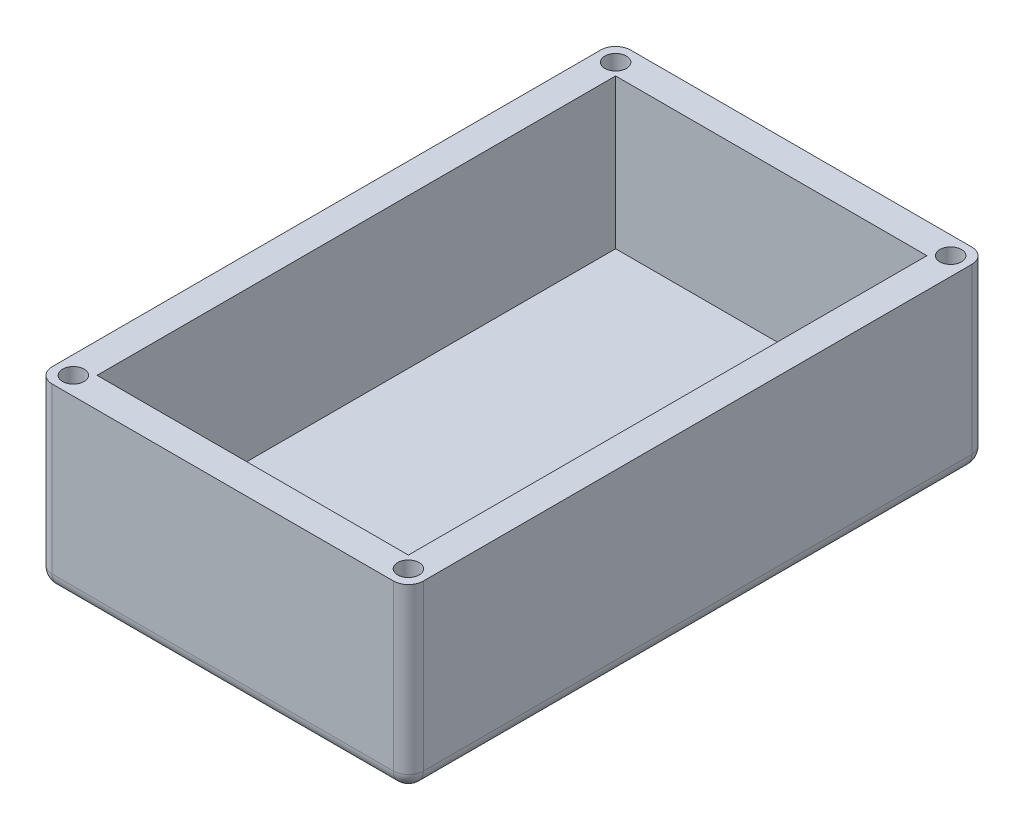
ISO-10303-21;
HEADER;
FILE_DESCRIPTION(('STEP AP214'),'2;1');
FILE_NAME('part.step','',(''),(''),'','','');
FILE_SCHEMA(('AUTOMOTIVE_DESIGN { 1 0 10303 214 1 1 1 1 }'));
ENDSEC;
DATA;
#1=APPLICATION_CONTEXT('core data for automotive mechanical design processes');
#2=APPLICATION_PROTOCOL_DEFINITION('international standard','automotive_design',2000,#1);
#3=PRODUCT_CONTEXT('',#1,'mechanical');
#4=PRODUCT('Part','Part','',(#3));
#5=PRODUCT_RELATED_PRODUCT_CATEGORY('part','',(#4));
#6=PRODUCT_DEFINITION_FORMATION('','',#4);
#7=PRODUCT_DEFINITION_CONTEXT('part definition',#1,'design');
#8=PRODUCT_DEFINITION('design','',#6,#7);
#9=PRODUCT_DEFINITION_SHAPE('','',#8);
#10=(LENGTH_UNIT() NAMED_UNIT(*) SI_UNIT(.MILLI.,.METRE.));
#11=(NAMED_UNIT(*) PLANE_ANGLE_UNIT() SI_UNIT($,.RADIAN.));
#12=(NAMED_UNIT(*) SI_UNIT($,.STERADIAN.) SOLID_ANGLE_UNIT());
#13=UNCERTAINTY_MEASURE_WITH_UNIT(LENGTH_MEASURE(1.E-05),#10,'distance_accuracy_value','');
#14=(GEOMETRIC_REPRESENTATION_CONTEXT(3) GLOBAL_UNCERTAINTY_ASSIGNED_CONTEXT((#13)) GLOBAL_UNIT_ASSIGNED_CONTEXT((#10,
#11,#12)) REPRESENTATION_CONTEXT('',''));
#15=CARTESIAN_POINT('',(0.,0.,0.));
#16=DIRECTION('',(0.,0.,1.));
#17=DIRECTION('',(1.,0.,0.));
#18=AXIS2_PLACEMENT_3D('',#15,#16,#17);
#19=CARTESIAN_POINT('',(0.,19.05,0.));
#20=DIRECTION('',(0.,-1.,0.));
#21=DIRECTION('',(0.,0.,-1.));
#22=AXIS2_PLACEMENT_3D('',#19,#20,#21);
#23=PLANE('',#22);
#24=CARTESIAN_POINT('',(-17.7672358569497,19.05,28.7572358569497));
#25=DIRECTION('',(0.,1.,0.));
#26=DIRECTION('',(0.,0.,1.));
#27=AXIS2_PLACEMENT_3D('',#24,#25,#26);
#28=CIRCLE('',#27,1.143);
#29=CARTESIAN_POINT('',(-17.7672358569497,19.05,29.9002358569497));
#30=VERTEX_POINT('',#29);
#31=EDGE_CURVE('E409',#30,#30,#28,.F.);
#32=ORIENTED_EDGE('',*,*,#31,.T.);
#33=EDGE_LOOP('',(#32));
#34=FACE_BOUND('',#33,.T.);
#35=DIRECTION('',(-1.,0.,0.));
#36=VECTOR('',#35,1.);
#37=CARTESIAN_POINT('',(19.685,19.05,30.675));
#38=LINE('',#37,#36);
#39=CARTESIAN_POINT('',(18.0975,19.05,30.675));
#40=VERTEX_POINT('',#39);
#41=CARTESIAN_POINT('',(-18.0975,19.05,30.675));
#42=VERTEX_POINT('',#41);
#43=EDGE_CURVE('E181',#40,#42,#38,.T.);
#44=ORIENTED_EDGE('',*,*,#43,.F.);
#45=CARTESIAN_POINT('',(18.0975,19.05,29.0875));
#46=DIRECTION('',(0.,-1.,0.));
#47=DIRECTION('',(0.,0.,-1.));
#48=AXIS2_PLACEMENT_3D('',#45,#46,#47);
#49=CIRCLE('',#48,1.5875);
#50=CARTESIAN_POINT('',(19.685,19.05,29.0875));
#51=VERTEX_POINT('',#50);
#52=EDGE_CURVE('E11',#40,#51,#49,.F.);
#53=ORIENTED_EDGE('',*,*,#52,.T.);
#54=DIRECTION('',(0.,0.,1.));
#55=VECTOR('',#54,1.);
#56=CARTESIAN_POINT('',(19.685,19.05,-30.675));
#57=LINE('',#56,#55);
#58=CARTESIAN_POINT('',(19.685,19.05,-29.0875));
#59=VERTEX_POINT('',#58);
#60=EDGE_CURVE('E175',#59,#51,#57,.T.);
#61=ORIENTED_EDGE('',*,*,#60,.F.);
#62=CARTESIAN_POINT('',(18.0975,19.05,-29.0875));
#63=DIRECTION('',(0.,-1.,0.));
#64=DIRECTION('',(0.,0.,-1.));
#65=AXIS2_PLACEMENT_3D('',#62,#63,#64);
#66=CIRCLE('',#65,1.5875);
#67=CARTESIAN_POINT('',(18.0975,19.05,-30.675));
#68=VERTEX_POINT('',#67);
#69=EDGE_CURVE('E46',#59,#68,#66,.F.);
#70=ORIENTED_EDGE('',*,*,#69,.T.);
#71=DIRECTION('',(1.,0.,0.));
#72=VECTOR('',#71,1.);
#73=CARTESIAN_POINT('',(-19.685,19.05,-30.675));
#74=LINE('',#73,#72);
#75=CARTESIAN_POINT('',(-18.0975,19.05,-30.675));
#76=VERTEX_POINT('',#75);
#77=EDGE_CURVE('E187',#76,#68,#74,.T.);
#78=ORIENTED_EDGE('',*,*,#77,.F.);
#79=CARTESIAN_POINT('',(-18.0975,19.05,-29.0875));
#80=DIRECTION('',(0.,-1.,0.));
#81=DIRECTION('',(0.,0.,-1.));
#82=AXIS2_PLACEMENT_3D('',#79,#80,#81);
#83=CIRCLE('',#82,1.5875);
#84=CARTESIAN_POINT('',(-19.685,19.05,-29.0875));
#85=VERTEX_POINT('',#84);
#86=EDGE_CURVE('E231',#76,#85,#83,.F.);
#87=ORIENTED_EDGE('',*,*,#86,.T.);
#88=DIRECTION('',(0.,0.,-1.));
#89=VECTOR('',#88,1.);
#90=CARTESIAN_POINT('',(-19.685,19.05,30.675));
#91=LINE('',#90,#89);
#92=CARTESIAN_POINT('',(-19.685,19.05,29.0875));
#93=VERTEX_POINT('',#92);
#94=EDGE_CURVE('E184',#93,#85,#91,.T.);
#95=ORIENTED_EDGE('',*,*,#94,.F.);
#96=CARTESIAN_POINT('',(-18.0975,19.05,29.0875));
#97=DIRECTION('',(0.,-1.,0.));
#98=DIRECTION('',(0.,0.,-1.));
#99=AXIS2_PLACEMENT_3D('',#96,#97,#98);
#100=CIRCLE('',#99,1.5875);
#101=EDGE_CURVE('E229',#93,#42,#100,.F.);
#102=ORIENTED_EDGE('',*,*,#101,.T.);
#103=EDGE_LOOP('',(#44,#53,#61,#70,#78,#87,#95,#102));
#104=FACE_BOUND('',#103,.T.);
#105=DIRECTION('',(1.,0.,0.));
#106=VECTOR('',#105,1.);
#107=CARTESIAN_POINT('',(-16.51,19.05,-27.5));
#108=LINE('',#107,#106);
#109=CARTESIAN_POINT('',(-16.51,19.05,-27.5));
#110=VERTEX_POINT('',#109);
#111=CARTESIAN_POINT('',(16.51,19.05,-27.5));
#112=VERTEX_POINT('',#111);
#113=EDGE_CURVE('E151',#110,#112,#108,.T.);
#114=ORIENTED_EDGE('',*,*,#113,.T.);
#115=DIRECTION('',(0.,0.,1.));
#116=VECTOR('',#115,1.);
#117=CARTESIAN_POINT('',(16.51,19.05,-27.5));
#118=LINE('',#117,#116);
#119=CARTESIAN_POINT('',(16.51,19.05,27.5));
#120=VERTEX_POINT('',#119);
#121=EDGE_CURVE('E144',#112,#120,#118,.T.);
#122=ORIENTED_EDGE('',*,*,#121,.T.);
#123=DIRECTION('',(-1.,0.,0.));
#124=VECTOR('',#123,1.);
#125=CARTESIAN_POINT('',(16.51,19.05,27.5));
#126=LINE('',#125,#124);
#127=CARTESIAN_POINT('',(-16.51,19.05,27.5));
#128=VERTEX_POINT('',#127);
#129=EDGE_CURVE('E155',#120,#128,#126,.T.);
#130=ORIENTED_EDGE('',*,*,#129,.T.);
#131=DIRECTION('',(0.,0.,-1.));
#132=VECTOR('',#131,1.);
#133=CARTESIAN_POINT('',(-16.51,19.05,27.5));
#134=LINE('',#133,#132);
#135=EDGE_CURVE('E160',#128,#110,#134,.T.);
#136=ORIENTED_EDGE('',*,*,#135,.T.);
#137=EDGE_LOOP('',(#114,#122,#130,#136));
#138=FACE_BOUND('',#137,.T.);
#139=CARTESIAN_POINT('',(-17.7672358569497,19.05,-28.7572358569497));
#140=DIRECTION('',(0.,1.,0.));
#141=DIRECTION('',(0.,0.,1.));
#142=AXIS2_PLACEMENT_3D('',#139,#140,#141);
#143=CIRCLE('',#142,1.143);
#144=CARTESIAN_POINT('',(-17.7672358569497,19.05,-27.6142358569497));
#145=VERTEX_POINT('',#144);
#146=EDGE_CURVE('E168',#145,#145,#143,.T.);
#147=ORIENTED_EDGE('',*,*,#146,.F.);
#148=EDGE_LOOP('',(#147));
#149=FACE_BOUND('',#148,.T.);
#150=CARTESIAN_POINT('',(17.7672358569497,19.05,-28.7572358569497));
#151=DIRECTION('',(0.,1.,0.));
#152=DIRECTION('',(0.,0.,1.));
#153=AXIS2_PLACEMENT_3D('',#150,#151,#152);
#154=CIRCLE('',#153,1.143);
#155=CARTESIAN_POINT('',(17.7672358569497,19.05,-27.6142358569497));
#156=VERTEX_POINT('',#155);
#157=EDGE_CURVE('E423',#156,#156,#154,.F.);
#158=ORIENTED_EDGE('',*,*,#157,.T.);
#159=EDGE_LOOP('',(#158));
#160=FACE_BOUND('',#159,.T.);
#161=CARTESIAN_POINT('',(17.7672358569497,19.05,28.7572358569497));
#162=DIRECTION('',(0.,1.,0.));
#163=DIRECTION('',(0.,0.,1.));
#164=AXIS2_PLACEMENT_3D('',#161,#162,#163);
#165=CIRCLE('',#164,1.143);
#166=CARTESIAN_POINT('',(17.7672358569497,19.05,29.9002358569497));
#167=VERTEX_POINT('',#166);
#168=EDGE_CURVE('E417',#167,#167,#165,.T.);
#169=ORIENTED_EDGE('',*,*,#168,.F.);
#170=EDGE_LOOP('',(#169));
#171=FACE_BOUND('',#170,.T.);
#172=ADVANCED_FACE('F37',(#34,#104,#138,#149,#160,#171),#23,.F.);
#173=CARTESIAN_POINT('',(0.,3.175,0.));
#174=DIRECTION('',(0.,1.,0.));
#175=DIRECTION('',(0.,0.,1.));
#176=AXIS2_PLACEMENT_3D('',#173,#174,#175);
#177=PLANE('',#176);
#178=DIRECTION('',(1.,0.,0.));
#179=VECTOR('',#178,1.);
#180=CARTESIAN_POINT('',(0.,3.175,27.5));
#181=LINE('',#180,#179);
#182=CARTESIAN_POINT('',(-16.51,3.17500000000001,27.5));
#183=VERTEX_POINT('',#182);
#184=CARTESIAN_POINT('',(16.51,3.175,27.5));
#185=VERTEX_POINT('',#184);
#186=EDGE_CURVE('E190',#183,#185,#181,.T.);
#187=ORIENTED_EDGE('',*,*,#186,.T.);
#188=DIRECTION('',(0.,0.,-1.));
#189=VECTOR('',#188,1.);
#190=CARTESIAN_POINT('',(16.51,3.175,0.));
#191=LINE('',#190,#189);
#192=CARTESIAN_POINT('',(16.51,3.17500000000001,-27.5));
#193=VERTEX_POINT('',#192);
#194=EDGE_CURVE('E147',#185,#193,#191,.T.);
#195=ORIENTED_EDGE('',*,*,#194,.T.);
#196=DIRECTION('',(1.,0.,0.));
#197=VECTOR('',#196,1.);
#198=CARTESIAN_POINT('',(0.,3.175,-27.5));
#199=LINE('',#198,#197);
#200=CARTESIAN_POINT('',(-16.51,3.17500000000001,-27.5));
#201=VERTEX_POINT('',#200);
#202=EDGE_CURVE('E193',#201,#193,#199,.T.);
#203=ORIENTED_EDGE('',*,*,#202,.F.);
#204=DIRECTION('',(0.,0.,-1.));
#205=VECTOR('',#204,1.);
#206=CARTESIAN_POINT('',(-16.51,3.175,0.));
#207=LINE('',#206,#205);
#208=EDGE_CURVE('E195',#183,#201,#207,.T.);
#209=ORIENTED_EDGE('',*,*,#208,.F.);
#210=EDGE_LOOP('',(#187,#195,#203,#209));
#211=FACE_BOUND('',#210,.T.);
#212=ADVANCED_FACE('F338',(#211),#177,.T.);
#213=CARTESIAN_POINT('',(19.685,19.05,-30.675));
#214=DIRECTION('',(1.,0.,0.));
#215=DIRECTION('',(0.,0.,-1.));
#216=AXIS2_PLACEMENT_3D('',#213,#214,#215);
#217=PLANE('',#216);
#218=ORIENTED_EDGE('',*,*,#60,.T.);
#219=DIRECTION('',(0.,-1.,0.));
#220=VECTOR('',#219,1.);
#221=CARTESIAN_POINT('',(19.685,19.05,29.0875));
#222=LINE('',#221,#220);
#223=CARTESIAN_POINT('',(19.685,1.5875,29.0875));
#224=VERTEX_POINT('',#223);
#225=EDGE_CURVE('E54',#51,#224,#222,.T.);
#226=ORIENTED_EDGE('',*,*,#225,.T.);
#227=DIRECTION('',(0.,0.,1.));
#228=VECTOR('',#227,1.);
#229=CARTESIAN_POINT('',(19.685,1.5875,-30.675));
#230=LINE('',#229,#228);
#231=CARTESIAN_POINT('',(19.685,1.5875,-29.0875));
#232=VERTEX_POINT('',#231);
#233=EDGE_CURVE('E59',#224,#232,#230,.F.);
#234=ORIENTED_EDGE('',*,*,#233,.T.);
#235=DIRECTION('',(0.,-1.,0.));
#236=VECTOR('',#235,1.);
#237=CARTESIAN_POINT('',(19.685,19.05,-29.0875));
#238=LINE('',#237,#236);
#239=EDGE_CURVE('E225',#232,#59,#238,.F.);
#240=ORIENTED_EDGE('',*,*,#239,.T.);
#241=EDGE_LOOP('',(#218,#226,#234,#240));
#242=FACE_BOUND('',#241,.T.);
#243=ADVANCED_FACE('F313',(#242),#217,.T.);
#244=CARTESIAN_POINT('',(-19.685,19.05,-30.675));
#245=DIRECTION('',(0.,0.,-1.));
#246=DIRECTION('',(-1.,0.,0.));
#247=AXIS2_PLACEMENT_3D('',#244,#245,#246);
#248=PLANE('',#247);
#249=ORIENTED_EDGE('',*,*,#77,.T.);
#250=DIRECTION('',(0.,-1.,0.));
#251=VECTOR('',#250,1.);
#252=CARTESIAN_POINT('',(18.0975,19.05,-30.675));
#253=LINE('',#252,#251);
#254=CARTESIAN_POINT('',(18.0975,1.5875,-30.675));
#255=VERTEX_POINT('',#254);
#256=EDGE_CURVE('E211',#68,#255,#253,.T.);
#257=ORIENTED_EDGE('',*,*,#256,.T.);
#258=DIRECTION('',(1.,0.,0.));
#259=VECTOR('',#258,1.);
#260=CARTESIAN_POINT('',(-19.685,1.5875,-30.675));
#261=LINE('',#260,#259);
#262=CARTESIAN_POINT('',(-18.0975,1.5875,-30.675));
#263=VERTEX_POINT('',#262);
#264=EDGE_CURVE('E208',#255,#263,#261,.F.);
#265=ORIENTED_EDGE('',*,*,#264,.T.);
#266=DIRECTION('',(0.,-1.,0.));
#267=VECTOR('',#266,1.);
#268=CARTESIAN_POINT('',(-18.0975,19.05,-30.675));
#269=LINE('',#268,#267);
#270=EDGE_CURVE('E206',#263,#76,#269,.F.);
#271=ORIENTED_EDGE('',*,*,#270,.T.);
#272=EDGE_LOOP('',(#249,#257,#265,#271));
#273=FACE_BOUND('',#272,.T.);
#274=ADVANCED_FACE('F320',(#273),#248,.T.);
#275=CARTESIAN_POINT('',(-19.685,19.05,30.675));
#276=DIRECTION('',(-1.,0.,0.));
#277=DIRECTION('',(0.,0.,1.));
#278=AXIS2_PLACEMENT_3D('',#275,#276,#277);
#279=PLANE('',#278);
#280=ORIENTED_EDGE('',*,*,#94,.T.);
#281=DIRECTION('',(0.,-1.,0.));
#282=VECTOR('',#281,1.);
#283=CARTESIAN_POINT('',(-19.685,19.05,-29.0875));
#284=LINE('',#283,#282);
#285=CARTESIAN_POINT('',(-19.685,1.5875,-29.0875));
#286=VERTEX_POINT('',#285);
#287=EDGE_CURVE('E217',#85,#286,#284,.T.);
#288=ORIENTED_EDGE('',*,*,#287,.T.);
#289=DIRECTION('',(0.,0.,-1.));
#290=VECTOR('',#289,1.);
#291=CARTESIAN_POINT('',(-19.685,1.5875,30.675));
#292=LINE('',#291,#290);
#293=CARTESIAN_POINT('',(-19.685,1.5875,29.0875));
#294=VERTEX_POINT('',#293);
#295=EDGE_CURVE('E215',#286,#294,#292,.F.);
#296=ORIENTED_EDGE('',*,*,#295,.T.);
#297=DIRECTION('',(0.,-1.,0.));
#298=VECTOR('',#297,1.);
#299=CARTESIAN_POINT('',(-19.685,19.05,29.0875));
#300=LINE('',#299,#298);
#301=EDGE_CURVE('E213',#294,#93,#300,.F.);
#302=ORIENTED_EDGE('',*,*,#301,.T.);
#303=EDGE_LOOP('',(#280,#288,#296,#302));
#304=FACE_BOUND('',#303,.T.);
#305=ADVANCED_FACE('F282',(#304),#279,.T.);
#306=CARTESIAN_POINT('',(19.685,19.05,30.675));
#307=DIRECTION('',(0.,0.,1.));
#308=DIRECTION('',(1.,0.,0.));
#309=AXIS2_PLACEMENT_3D('',#306,#307,#308);
#310=PLANE('',#309);
#311=DIRECTION('',(-1.,0.,0.));
#312=VECTOR('',#311,1.);
#313=CARTESIAN_POINT('',(19.685,1.5875,30.675));
#314=LINE('',#313,#312);
#315=CARTESIAN_POINT('',(-18.0975,1.5875,30.675));
#316=VERTEX_POINT('',#315);
#317=CARTESIAN_POINT('',(18.0975,1.5875,30.675));
#318=VERTEX_POINT('',#317);
#319=EDGE_CURVE('E221',#316,#318,#314,.F.);
#320=ORIENTED_EDGE('',*,*,#319,.T.);
#321=DIRECTION('',(0.,-1.,0.));
#322=VECTOR('',#321,1.);
#323=CARTESIAN_POINT('',(18.0975,19.05,30.675));
#324=LINE('',#323,#322);
#325=EDGE_CURVE('E223',#318,#40,#324,.F.);
#326=ORIENTED_EDGE('',*,*,#325,.T.);
#327=ORIENTED_EDGE('',*,*,#43,.T.);
#328=DIRECTION('',(0.,-1.,0.));
#329=VECTOR('',#328,1.);
#330=CARTESIAN_POINT('',(-18.0975,19.05,30.675));
#331=LINE('',#330,#329);
#332=EDGE_CURVE('E219',#42,#316,#331,.T.);
#333=ORIENTED_EDGE('',*,*,#332,.T.);
#334=EDGE_LOOP('',(#320,#326,#327,#333));
#335=FACE_BOUND('',#334,.T.);
#336=ADVANCED_FACE('F310',(#335),#310,.T.);
#337=CARTESIAN_POINT('',(16.51,19.05,-27.5));
#338=DIRECTION('',(1.,0.,0.));
#339=DIRECTION('',(0.,0.,-1.));
#340=AXIS2_PLACEMENT_3D('',#337,#338,#339);
#341=PLANE('',#340);
#342=ORIENTED_EDGE('',*,*,#194,.F.);
#343=DIRECTION('',(0.,-1.,0.));
#344=VECTOR('',#343,1.);
#345=CARTESIAN_POINT('',(16.51,19.05,27.5));
#346=LINE('',#345,#344);
#347=EDGE_CURVE('E139',#120,#185,#346,.T.);
#348=ORIENTED_EDGE('',*,*,#347,.F.);
#349=ORIENTED_EDGE('',*,*,#121,.F.);
#350=DIRECTION('',(0.,-1.,0.));
#351=VECTOR('',#350,1.);
#352=CARTESIAN_POINT('',(16.51,19.05,-27.5));
#353=LINE('',#352,#351);
#354=EDGE_CURVE('E173',#112,#193,#353,.T.);
#355=ORIENTED_EDGE('',*,*,#354,.T.);
#356=EDGE_LOOP('',(#342,#348,#349,#355));
#357=FACE_BOUND('',#356,.T.);
#358=ADVANCED_FACE('F141',(#357),#341,.F.);
#359=CARTESIAN_POINT('',(-16.51,19.05,-27.5));
#360=DIRECTION('',(0.,0.,-1.));
#361=DIRECTION('',(-1.,0.,0.));
#362=AXIS2_PLACEMENT_3D('',#359,#360,#361);
#363=PLANE('',#362);
#364=ORIENTED_EDGE('',*,*,#202,.T.);
#365=ORIENTED_EDGE('',*,*,#354,.F.);
#366=ORIENTED_EDGE('',*,*,#113,.F.);
#367=DIRECTION('',(0.,-1.,0.));
#368=VECTOR('',#367,1.);
#369=CARTESIAN_POINT('',(-16.51,19.05,-27.5));
#370=LINE('',#369,#368);
#371=EDGE_CURVE('E176',#110,#201,#370,.T.);
#372=ORIENTED_EDGE('',*,*,#371,.T.);
#373=EDGE_LOOP('',(#364,#365,#366,#372));
#374=FACE_BOUND('',#373,.T.);
#375=ADVANCED_FACE('F367',(#374),#363,.F.);
#376=CARTESIAN_POINT('',(-16.51,19.05,27.5));
#377=DIRECTION('',(-1.,0.,0.));
#378=DIRECTION('',(0.,0.,1.));
#379=AXIS2_PLACEMENT_3D('',#376,#377,#378);
#380=PLANE('',#379);
#381=ORIENTED_EDGE('',*,*,#208,.T.);
#382=ORIENTED_EDGE('',*,*,#371,.F.);
#383=ORIENTED_EDGE('',*,*,#135,.F.);
#384=DIRECTION('',(0.,-1.,0.));
#385=VECTOR('',#384,1.);
#386=CARTESIAN_POINT('',(-16.51,19.05,27.5));
#387=LINE('',#386,#385);
#388=EDGE_CURVE('E150',#128,#183,#387,.T.);
#389=ORIENTED_EDGE('',*,*,#388,.T.);
#390=EDGE_LOOP('',(#381,#382,#383,#389));
#391=FACE_BOUND('',#390,.T.);
#392=ADVANCED_FACE('F363',(#391),#380,.F.);
#393=CARTESIAN_POINT('',(16.51,19.05,27.5));
#394=DIRECTION('',(0.,0.,1.));
#395=DIRECTION('',(1.,0.,0.));
#396=AXIS2_PLACEMENT_3D('',#393,#394,#395);
#397=PLANE('',#396);
#398=ORIENTED_EDGE('',*,*,#186,.F.);
#399=ORIENTED_EDGE('',*,*,#388,.F.);
#400=ORIENTED_EDGE('',*,*,#129,.F.);
#401=ORIENTED_EDGE('',*,*,#347,.T.);
#402=EDGE_LOOP('',(#398,#399,#400,#401));
#403=FACE_BOUND('',#402,.T.);
#404=ADVANCED_FACE('F156',(#403),#397,.F.);
#405=CARTESIAN_POINT('',(0.,0.,0.));
#406=DIRECTION('',(0.,1.,0.));
#407=DIRECTION('',(0.,0.,1.));
#408=AXIS2_PLACEMENT_3D('',#405,#406,#407);
#409=PLANE('',#408);
#410=DIRECTION('',(0.,0.,-1.));
#411=VECTOR('',#410,1.);
#412=CARTESIAN_POINT('',(-18.0975,0.,-30.675));
#413=LINE('',#412,#411);
#414=CARTESIAN_POINT('',(-18.0975,0.,29.0875));
#415=VERTEX_POINT('',#414);
#416=CARTESIAN_POINT('',(-18.0975,0.,-29.0875));
#417=VERTEX_POINT('',#416);
#418=EDGE_CURVE('E201',#415,#417,#413,.T.);
#419=ORIENTED_EDGE('',*,*,#418,.T.);
#420=DIRECTION('',(1.,0.,0.));
#421=VECTOR('',#420,1.);
#422=CARTESIAN_POINT('',(19.685,0.,-29.0875));
#423=LINE('',#422,#421);
#424=CARTESIAN_POINT('',(18.0975,0.,-29.0875));
#425=VERTEX_POINT('',#424);
#426=EDGE_CURVE('E203',#417,#425,#423,.T.);
#427=ORIENTED_EDGE('',*,*,#426,.T.);
#428=DIRECTION('',(0.,0.,1.));
#429=VECTOR('',#428,1.);
#430=CARTESIAN_POINT('',(18.0975,0.,30.675));
#431=LINE('',#430,#429);
#432=CARTESIAN_POINT('',(18.0975,0.,29.0875));
#433=VERTEX_POINT('',#432);
#434=EDGE_CURVE('E197',#425,#433,#431,.T.);
#435=ORIENTED_EDGE('',*,*,#434,.T.);
#436=DIRECTION('',(-1.,0.,0.));
#437=VECTOR('',#436,1.);
#438=CARTESIAN_POINT('',(-19.685,0.,29.0875));
#439=LINE('',#438,#437);
#440=EDGE_CURVE('E199',#433,#415,#439,.T.);
#441=ORIENTED_EDGE('',*,*,#440,.T.);
#442=EDGE_LOOP('',(#419,#427,#435,#441));
#443=FACE_BOUND('',#442,.T.);
#444=ADVANCED_FACE('F298',(#443),#409,.F.);
#445=CARTESIAN_POINT('',(-18.0975,19.05,29.0875));
#446=DIRECTION('',(0.,-1.,0.));
#447=DIRECTION('',(0.,0.,-1.));
#448=AXIS2_PLACEMENT_3D('',#445,#446,#447);
#449=CYLINDRICAL_SURFACE('',#448,1.5875);
#450=ORIENTED_EDGE('',*,*,#101,.F.);
#451=ORIENTED_EDGE('',*,*,#301,.F.);
#452=CARTESIAN_POINT('',(-18.0975,1.5875,29.0875));
#453=DIRECTION('',(0.,-1.,0.));
#454=DIRECTION('',(0.,0.,-1.));
#455=AXIS2_PLACEMENT_3D('',#452,#453,#454);
#456=CIRCLE('',#455,1.5875);
#457=EDGE_CURVE('E41',#316,#294,#456,.T.);
#458=ORIENTED_EDGE('',*,*,#457,.F.);
#459=ORIENTED_EDGE('',*,*,#332,.F.);
#460=EDGE_LOOP('',(#450,#451,#458,#459));
#461=FACE_BOUND('',#460,.T.);
#462=ADVANCED_FACE('F39',(#461),#449,.T.);
#463=CARTESIAN_POINT('',(0.,1.5875,29.0875));
#464=DIRECTION('',(1.,0.,0.));
#465=DIRECTION('',(0.,0.,-1.));
#466=AXIS2_PLACEMENT_3D('',#463,#464,#465);
#467=CYLINDRICAL_SURFACE('',#466,1.5875);
#468=CARTESIAN_POINT('',(18.0975,1.5875,29.0875));
#469=DIRECTION('',(1.,0.,0.));
#470=DIRECTION('',(0.,0.,-1.));
#471=AXIS2_PLACEMENT_3D('',#468,#469,#470);
#472=CIRCLE('',#471,1.5875);
#473=EDGE_CURVE('E260',#318,#433,#472,.T.);
#474=ORIENTED_EDGE('',*,*,#473,.F.);
#475=ORIENTED_EDGE('',*,*,#319,.F.);
#476=CARTESIAN_POINT('',(-18.0975,1.5875,29.0875));
#477=DIRECTION('',(-1.,0.,0.));
#478=DIRECTION('',(0.,0.,1.));
#479=AXIS2_PLACEMENT_3D('',#476,#477,#478);
#480=CIRCLE('',#479,1.5875);
#481=EDGE_CURVE('E166',#415,#316,#480,.T.);
#482=ORIENTED_EDGE('',*,*,#481,.F.);
#483=ORIENTED_EDGE('',*,*,#440,.F.);
#484=EDGE_LOOP('',(#474,#475,#482,#483));
#485=FACE_BOUND('',#484,.T.);
#486=ADVANCED_FACE('F273',(#485),#467,.T.);
#487=CARTESIAN_POINT('',(18.0975,19.05,29.0875));
#488=DIRECTION('',(0.,-1.,0.));
#489=DIRECTION('',(0.,0.,-1.));
#490=AXIS2_PLACEMENT_3D('',#487,#488,#489);
#491=CYLINDRICAL_SURFACE('',#490,1.5875);
#492=ORIENTED_EDGE('',*,*,#52,.F.);
#493=ORIENTED_EDGE('',*,*,#325,.F.);
#494=CARTESIAN_POINT('',(18.0975,1.5875,29.0875));
#495=DIRECTION('',(0.,-1.,0.));
#496=DIRECTION('',(0.,0.,-1.));
#497=AXIS2_PLACEMENT_3D('',#494,#495,#496);
#498=CIRCLE('',#497,1.5875);
#499=EDGE_CURVE('E257',#224,#318,#498,.T.);
#500=ORIENTED_EDGE('',*,*,#499,.F.);
#501=ORIENTED_EDGE('',*,*,#225,.F.);
#502=EDGE_LOOP('',(#492,#493,#500,#501));
#503=FACE_BOUND('',#502,.T.);
#504=ADVANCED_FACE('F309',(#503),#491,.T.);
#505=CARTESIAN_POINT('',(-18.0975,1.5875,29.0875));
#506=DIRECTION('',(0.,0.,1.));
#507=DIRECTION('',(1.,0.,0.));
#508=AXIS2_PLACEMENT_3D('',#505,#506,#507);
#509=SPHERICAL_SURFACE('',#508,1.5875);
#510=ORIENTED_EDGE('',*,*,#481,.T.);
#511=ORIENTED_EDGE('',*,*,#457,.T.);
#512=CARTESIAN_POINT('',(-18.0975,1.5875,29.0875));
#513=DIRECTION('',(0.,0.,1.));
#514=DIRECTION('',(1.,0.,0.));
#515=AXIS2_PLACEMENT_3D('',#512,#513,#514);
#516=CIRCLE('',#515,1.5875);
#517=EDGE_CURVE('E254',#415,#294,#516,.F.);
#518=ORIENTED_EDGE('',*,*,#517,.F.);
#519=EDGE_LOOP('',(#510,#511,#518));
#520=FACE_BOUND('',#519,.T.);
#521=ADVANCED_FACE('F266',(#520),#509,.T.);
#522=CARTESIAN_POINT('',(18.0975,1.5875,29.0875));
#523=DIRECTION('',(0.,0.,1.));
#524=DIRECTION('',(1.,0.,0.));
#525=AXIS2_PLACEMENT_3D('',#522,#523,#524);
#526=SPHERICAL_SURFACE('',#525,1.5875);
#527=ORIENTED_EDGE('',*,*,#499,.T.);
#528=ORIENTED_EDGE('',*,*,#473,.T.);
#529=CARTESIAN_POINT('',(18.0975,1.5875,29.0875));
#530=DIRECTION('',(0.,0.,1.));
#531=DIRECTION('',(1.,0.,0.));
#532=AXIS2_PLACEMENT_3D('',#529,#530,#531);
#533=CIRCLE('',#532,1.5875);
#534=EDGE_CURVE('E251',#224,#433,#533,.F.);
#535=ORIENTED_EDGE('',*,*,#534,.F.);
#536=EDGE_LOOP('',(#527,#528,#535));
#537=FACE_BOUND('',#536,.T.);
#538=ADVANCED_FACE('F306',(#537),#526,.T.);
#539=CARTESIAN_POINT('',(-18.0975,19.05,-29.0875));
#540=DIRECTION('',(0.,-1.,0.));
#541=DIRECTION('',(0.,0.,-1.));
#542=AXIS2_PLACEMENT_3D('',#539,#540,#541);
#543=CYLINDRICAL_SURFACE('',#542,1.5875);
#544=ORIENTED_EDGE('',*,*,#86,.F.);
#545=ORIENTED_EDGE('',*,*,#270,.F.);
#546=CARTESIAN_POINT('',(-18.0975,1.5875,-29.0875));
#547=DIRECTION('',(0.,-1.,0.));
#548=DIRECTION('',(0.,0.,-1.));
#549=AXIS2_PLACEMENT_3D('',#546,#547,#548);
#550=CIRCLE('',#549,1.5875);
#551=EDGE_CURVE('E248',#286,#263,#550,.T.);
#552=ORIENTED_EDGE('',*,*,#551,.F.);
#553=ORIENTED_EDGE('',*,*,#287,.F.);
#554=EDGE_LOOP('',(#544,#545,#552,#553));
#555=FACE_BOUND('',#554,.T.);
#556=ADVANCED_FACE('F291',(#555),#543,.T.);
#557=CARTESIAN_POINT('',(-18.0975,1.5875,0.));
#558=DIRECTION('',(0.,0.,1.));
#559=DIRECTION('',(1.,0.,0.));
#560=AXIS2_PLACEMENT_3D('',#557,#558,#559);
#561=CYLINDRICAL_SURFACE('',#560,1.5875);
#562=ORIENTED_EDGE('',*,*,#517,.T.);
#563=ORIENTED_EDGE('',*,*,#295,.F.);
#564=CARTESIAN_POINT('',(-18.0975,1.5875,-29.0875));
#565=DIRECTION('',(0.,0.,-1.));
#566=DIRECTION('',(-1.,0.,0.));
#567=AXIS2_PLACEMENT_3D('',#564,#565,#566);
#568=CIRCLE('',#567,1.5875);
#569=EDGE_CURVE('E245',#417,#286,#568,.T.);
#570=ORIENTED_EDGE('',*,*,#569,.F.);
#571=ORIENTED_EDGE('',*,*,#418,.F.);
#572=EDGE_LOOP('',(#562,#563,#570,#571));
#573=FACE_BOUND('',#572,.T.);
#574=ADVANCED_FACE('F295',(#573),#561,.T.);
#575=CARTESIAN_POINT('',(18.0975,1.5875,0.));
#576=DIRECTION('',(0.,0.,-1.));
#577=DIRECTION('',(-1.,0.,0.));
#578=AXIS2_PLACEMENT_3D('',#575,#576,#577);
#579=CYLINDRICAL_SURFACE('',#578,1.5875);
#580=ORIENTED_EDGE('',*,*,#534,.T.);
#581=ORIENTED_EDGE('',*,*,#434,.F.);
#582=CARTESIAN_POINT('',(18.0975,1.5875,-29.0875));
#583=DIRECTION('',(0.,0.,-1.));
#584=DIRECTION('',(-1.,0.,0.));
#585=AXIS2_PLACEMENT_3D('',#582,#583,#584);
#586=CIRCLE('',#585,1.5875);
#587=EDGE_CURVE('E242',#232,#425,#586,.T.);
#588=ORIENTED_EDGE('',*,*,#587,.F.);
#589=ORIENTED_EDGE('',*,*,#233,.F.);
#590=EDGE_LOOP('',(#580,#581,#588,#589));
#591=FACE_BOUND('',#590,.T.);
#592=ADVANCED_FACE('F303',(#591),#579,.T.);
#593=CARTESIAN_POINT('',(18.0975,19.05,-29.0875));
#594=DIRECTION('',(0.,-1.,0.));
#595=DIRECTION('',(0.,0.,-1.));
#596=AXIS2_PLACEMENT_3D('',#593,#594,#595);
#597=CYLINDRICAL_SURFACE('',#596,1.5875);
#598=ORIENTED_EDGE('',*,*,#69,.F.);
#599=ORIENTED_EDGE('',*,*,#239,.F.);
#600=CARTESIAN_POINT('',(18.0975,1.5875,-29.0875));
#601=DIRECTION('',(0.,-1.,0.));
#602=DIRECTION('',(0.,0.,-1.));
#603=AXIS2_PLACEMENT_3D('',#600,#601,#602);
#604=CIRCLE('',#603,1.5875);
#605=EDGE_CURVE('E239',#255,#232,#604,.T.);
#606=ORIENTED_EDGE('',*,*,#605,.F.);
#607=ORIENTED_EDGE('',*,*,#256,.F.);
#608=EDGE_LOOP('',(#598,#599,#606,#607));
#609=FACE_BOUND('',#608,.T.);
#610=ADVANCED_FACE('F316',(#609),#597,.T.);
#611=CARTESIAN_POINT('',(-18.0975,1.5875,-29.0875));
#612=DIRECTION('',(0.,0.,1.));
#613=DIRECTION('',(1.,0.,0.));
#614=AXIS2_PLACEMENT_3D('',#611,#612,#613);
#615=SPHERICAL_SURFACE('',#614,1.5875);
#616=ORIENTED_EDGE('',*,*,#569,.T.);
#617=ORIENTED_EDGE('',*,*,#551,.T.);
#618=CARTESIAN_POINT('',(-18.0975,1.5875,-29.0875));
#619=DIRECTION('',(-1.,0.,0.));
#620=DIRECTION('',(0.,0.,1.));
#621=AXIS2_PLACEMENT_3D('',#618,#619,#620);
#622=CIRCLE('',#621,1.5875);
#623=EDGE_CURVE('E236',#417,#263,#622,.F.);
#624=ORIENTED_EDGE('',*,*,#623,.F.);
#625=EDGE_LOOP('',(#616,#617,#624));
#626=FACE_BOUND('',#625,.T.);
#627=ADVANCED_FACE('F327',(#626),#615,.T.);
#628=CARTESIAN_POINT('',(18.0975,1.5875,-29.0875));
#629=DIRECTION('',(0.,0.,1.));
#630=DIRECTION('',(1.,0.,0.));
#631=AXIS2_PLACEMENT_3D('',#628,#629,#630);
#632=SPHERICAL_SURFACE('',#631,1.5875);
#633=ORIENTED_EDGE('',*,*,#605,.T.);
#634=ORIENTED_EDGE('',*,*,#587,.T.);
#635=CARTESIAN_POINT('',(18.0975,1.5875,-29.0875));
#636=DIRECTION('',(1.,0.,0.));
#637=DIRECTION('',(0.,0.,-1.));
#638=AXIS2_PLACEMENT_3D('',#635,#636,#637);
#639=CIRCLE('',#638,1.5875);
#640=EDGE_CURVE('E234',#255,#425,#639,.F.);
#641=ORIENTED_EDGE('',*,*,#640,.F.);
#642=EDGE_LOOP('',(#633,#634,#641));
#643=FACE_BOUND('',#642,.T.);
#644=ADVANCED_FACE('F325',(#643),#632,.T.);
#645=CARTESIAN_POINT('',(0.,1.5875,-29.0875));
#646=DIRECTION('',(-1.,0.,0.));
#647=DIRECTION('',(0.,0.,1.));
#648=AXIS2_PLACEMENT_3D('',#645,#646,#647);
#649=CYLINDRICAL_SURFACE('',#648,1.5875);
#650=ORIENTED_EDGE('',*,*,#623,.T.);
#651=ORIENTED_EDGE('',*,*,#264,.F.);
#652=ORIENTED_EDGE('',*,*,#640,.T.);
#653=ORIENTED_EDGE('',*,*,#426,.F.);
#654=EDGE_LOOP('',(#650,#651,#652,#653));
#655=FACE_BOUND('',#654,.T.);
#656=ADVANCED_FACE('F323',(#655),#649,.T.);
#657=CARTESIAN_POINT('',(-17.7672358569497,12.7,-28.7572358569497));
#658=DIRECTION('',(0.,1.,0.));
#659=DIRECTION('',(0.,0.,1.));
#660=AXIS2_PLACEMENT_3D('',#657,#658,#659);
#661=CYLINDRICAL_SURFACE('',#660,1.143);
#662=CARTESIAN_POINT('',(-17.7672358569497,12.7,-28.7572358569497));
#663=DIRECTION('',(0.,1.,0.));
#664=DIRECTION('',(0.,0.,1.));
#665=AXIS2_PLACEMENT_3D('',#662,#663,#664);
#666=CIRCLE('',#665,1.143);
#667=CARTESIAN_POINT('',(-17.7672358569497,12.7,-27.6142358569497));
#668=VERTEX_POINT('',#667);
#669=EDGE_CURVE('E237',#668,#668,#666,.T.);
#670=ORIENTED_EDGE('',*,*,#669,.F.);
#671=EDGE_LOOP('',(#670));
#672=FACE_BOUND('',#671,.T.);
#673=ORIENTED_EDGE('',*,*,#146,.T.);
#674=EDGE_LOOP('',(#673));
#675=FACE_BOUND('',#674,.T.);
#676=ADVANCED_FACE('F333',(#672,#675),#661,.F.);
#677=CARTESIAN_POINT('',(0.,12.7,0.));
#678=DIRECTION('',(0.,1.,0.));
#679=DIRECTION('',(0.,0.,1.));
#680=AXIS2_PLACEMENT_3D('',#677,#678,#679);
#681=PLANE('',#680);
#682=ORIENTED_EDGE('',*,*,#669,.T.);
#683=EDGE_LOOP('',(#682));
#684=FACE_BOUND('',#683,.T.);
#685=ADVANCED_FACE('F376',(#684),#681,.T.);
#686=CARTESIAN_POINT('',(17.7672358569497,12.7,-28.7572358569497));
#687=DIRECTION('',(0.,1.,0.));
#688=DIRECTION('',(0.,0.,1.));
#689=AXIS2_PLACEMENT_3D('',#686,#687,#688);
#690=CYLINDRICAL_SURFACE('',#689,1.143);
#691=CARTESIAN_POINT('',(17.7672358569497,12.7,-28.7572358569497));
#692=DIRECTION('',(0.,1.,0.));
#693=DIRECTION('',(0.,0.,1.));
#694=AXIS2_PLACEMENT_3D('',#691,#692,#693);
#695=CIRCLE('',#694,1.143);
#696=CARTESIAN_POINT('',(17.7672358569497,12.7,-27.6142358569497));
#697=VERTEX_POINT('',#696);
#698=EDGE_CURVE('E420',#697,#697,#695,.F.);
#699=ORIENTED_EDGE('',*,*,#698,.T.);
#700=EDGE_LOOP('',(#699));
#701=FACE_BOUND('',#700,.T.);
#702=ORIENTED_EDGE('',*,*,#157,.F.);
#703=EDGE_LOOP('',(#702));
#704=FACE_BOUND('',#703,.T.);
#705=ADVANCED_FACE('F380',(#701,#704),#690,.F.);
#706=CARTESIAN_POINT('',(0.,12.7,0.));
#707=DIRECTION('',(0.,1.,0.));
#708=DIRECTION('',(0.,0.,1.));
#709=AXIS2_PLACEMENT_3D('',#706,#707,#708);
#710=PLANE('',#709);
#711=ORIENTED_EDGE('',*,*,#698,.F.);
#712=EDGE_LOOP('',(#711));
#713=FACE_BOUND('',#712,.T.);
#714=ADVANCED_FACE('F384',(#713),#710,.T.);
#715=CARTESIAN_POINT('',(17.7672358569497,12.7,28.7572358569497));
#716=DIRECTION('',(0.,1.,0.));
#717=DIRECTION('',(0.,0.,1.));
#718=AXIS2_PLACEMENT_3D('',#715,#716,#717);
#719=CYLINDRICAL_SURFACE('',#718,1.143);
#720=CARTESIAN_POINT('',(17.7672358569497,12.7,28.7572358569497));
#721=DIRECTION('',(0.,1.,0.));
#722=DIRECTION('',(0.,0.,1.));
#723=AXIS2_PLACEMENT_3D('',#720,#721,#722);
#724=CIRCLE('',#723,1.143);
#725=CARTESIAN_POINT('',(17.7672358569497,12.7,29.9002358569497));
#726=VERTEX_POINT('',#725);
#727=EDGE_CURVE('E412',#726,#726,#724,.T.);
#728=ORIENTED_EDGE('',*,*,#727,.F.);
#729=EDGE_LOOP('',(#728));
#730=FACE_BOUND('',#729,.T.);
#731=ORIENTED_EDGE('',*,*,#168,.T.);
#732=EDGE_LOOP('',(#731));
#733=FACE_BOUND('',#732,.T.);
#734=ADVANCED_FACE('F388',(#730,#733),#719,.F.);
#735=CARTESIAN_POINT('',(0.,12.7,0.));
#736=DIRECTION('',(0.,1.,0.));
#737=DIRECTION('',(0.,0.,1.));
#738=AXIS2_PLACEMENT_3D('',#735,#736,#737);
#739=PLANE('',#738);
#740=ORIENTED_EDGE('',*,*,#727,.T.);
#741=EDGE_LOOP('',(#740));
#742=FACE_BOUND('',#741,.T.);
#743=ADVANCED_FACE('F392',(#742),#739,.T.);
#744=CARTESIAN_POINT('',(-17.7672358569497,12.7,28.7572358569497));
#745=DIRECTION('',(0.,1.,0.));
#746=DIRECTION('',(0.,0.,1.));
#747=AXIS2_PLACEMENT_3D('',#744,#745,#746);
#748=CYLINDRICAL_SURFACE('',#747,1.143);
#749=CARTESIAN_POINT('',(-17.7672358569497,12.7,28.7572358569497));
#750=DIRECTION('',(0.,1.,0.));
#751=DIRECTION('',(0.,0.,1.));
#752=AXIS2_PLACEMENT_3D('',#749,#750,#751);
#753=CIRCLE('',#752,1.143);
#754=CARTESIAN_POINT('',(-17.7672358569497,12.7,29.9002358569497));
#755=VERTEX_POINT('',#754);
#756=EDGE_CURVE('E408',#755,#755,#753,.F.);
#757=ORIENTED_EDGE('',*,*,#756,.T.);
#758=EDGE_LOOP('',(#757));
#759=FACE_BOUND('',#758,.T.);
#760=ORIENTED_EDGE('',*,*,#31,.F.);
#761=EDGE_LOOP('',(#760));
#762=FACE_BOUND('',#761,.T.);
#763=ADVANCED_FACE('F396',(#759,#762),#748,.F.);
#764=CARTESIAN_POINT('',(0.,12.7,0.));
#765=DIRECTION('',(0.,1.,0.));
#766=DIRECTION('',(0.,0.,1.));
#767=AXIS2_PLACEMENT_3D('',#764,#765,#766);
#768=PLANE('',#767);
#769=ORIENTED_EDGE('',*,*,#756,.F.);
#770=EDGE_LOOP('',(#769));
#771=FACE_BOUND('',#770,.T.);
#772=ADVANCED_FACE('F400',(#771),#768,.T.);
#773=CLOSED_SHELL('',(#172,#212,#243,#274,#305,#336,#358,#375,#392,#404,#444,#462,#486,#504,
#521,#538,#556,#574,#592,#610,#627,#644,#656,#676,#685,#705,#714,#734,#743,#763,#772));
#774=MANIFOLD_SOLID_BREP('B2',#773);
#775=ADVANCED_BREP_SHAPE_REPRESENTATION('',(#18,#774),#14);
#776=SHAPE_DEFINITION_REPRESENTATION(#9,#775);
ENDSEC;
END-ISO-10303-21;
